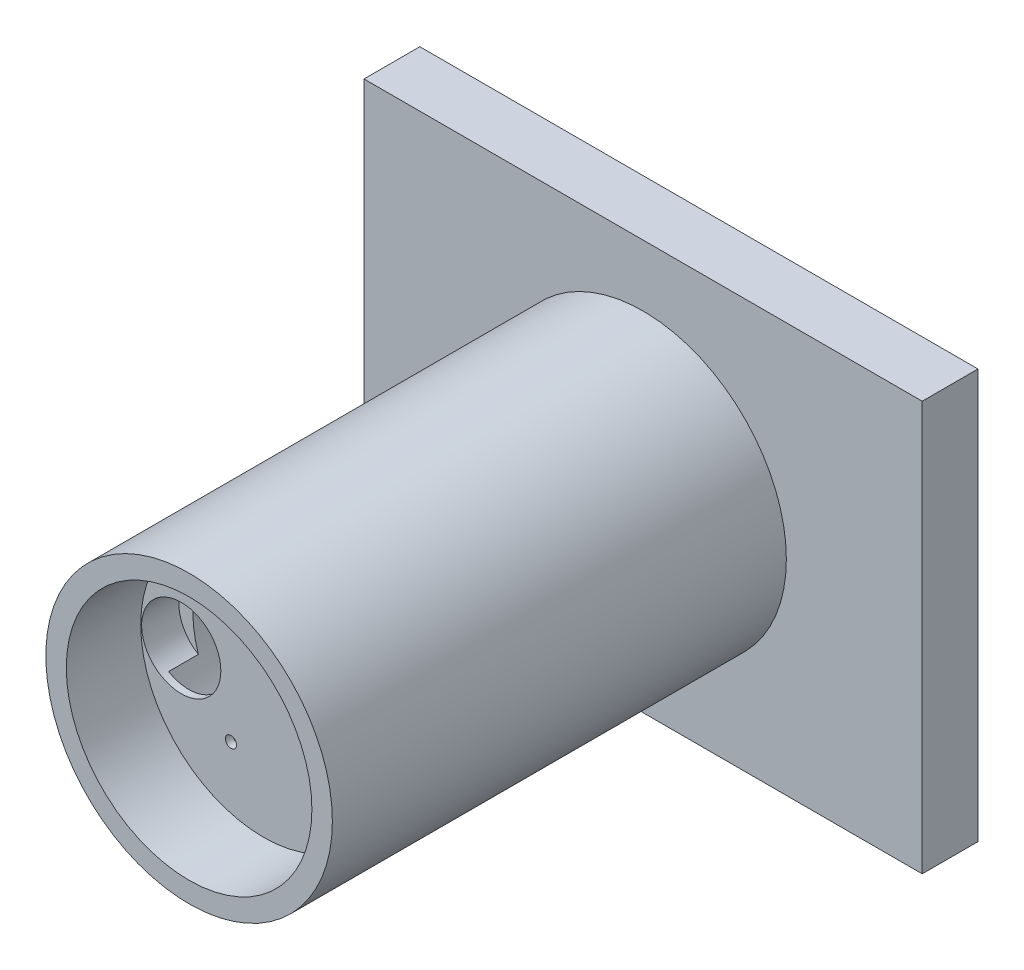
ISO-10303-21;
HEADER;
FILE_DESCRIPTION(('STEP AP214'),'2;1');
FILE_NAME('part.step','',(''),(''),'','','');
FILE_SCHEMA(('AUTOMOTIVE_DESIGN { 1 0 10303 214 1 1 1 1 }'));
ENDSEC;
DATA;
#1=APPLICATION_CONTEXT('core data for automotive mechanical design processes');
#2=APPLICATION_PROTOCOL_DEFINITION('international standard','automotive_design',2000,#1);
#3=PRODUCT_CONTEXT('',#1,'mechanical');
#4=PRODUCT('Part','Part','',(#3));
#5=PRODUCT_RELATED_PRODUCT_CATEGORY('part','',(#4));
#6=PRODUCT_DEFINITION_FORMATION('','',#4);
#7=PRODUCT_DEFINITION_CONTEXT('part definition',#1,'design');
#8=PRODUCT_DEFINITION('design','',#6,#7);
#9=PRODUCT_DEFINITION_SHAPE('','',#8);
#10=(LENGTH_UNIT() NAMED_UNIT(*) SI_UNIT(.MILLI.,.METRE.));
#11=(NAMED_UNIT(*) PLANE_ANGLE_UNIT() SI_UNIT($,.RADIAN.));
#12=(NAMED_UNIT(*) SI_UNIT($,.STERADIAN.) SOLID_ANGLE_UNIT());
#13=UNCERTAINTY_MEASURE_WITH_UNIT(LENGTH_MEASURE(1.E-05),#10,'distance_accuracy_value','');
#14=(GEOMETRIC_REPRESENTATION_CONTEXT(3) GLOBAL_UNCERTAINTY_ASSIGNED_CONTEXT((#13)) GLOBAL_UNIT_ASSIGNED_CONTEXT((#10,
#11,#12)) REPRESENTATION_CONTEXT('',''));
#15=CARTESIAN_POINT('',(0.,0.,0.));
#16=DIRECTION('',(0.,0.,1.));
#17=DIRECTION('',(1.,0.,0.));
#18=AXIS2_PLACEMENT_3D('',#15,#16,#17);
#19=CARTESIAN_POINT('',(75.,-55.,15.));
#20=DIRECTION('',(-1.,0.,0.));
#21=DIRECTION('',(0.,0.,1.));
#22=AXIS2_PLACEMENT_3D('',#19,#20,#21);
#23=PLANE('',#22);
#24=DIRECTION('',(0.,1.,0.));
#25=VECTOR('',#24,1.);
#26=CARTESIAN_POINT('',(75.,-55.,0.));
#27=LINE('',#26,#25);
#28=CARTESIAN_POINT('',(75.,-55.,0.));
#29=VERTEX_POINT('',#28);
#30=CARTESIAN_POINT('',(75.,55.,0.));
#31=VERTEX_POINT('',#30);
#32=EDGE_CURVE('E152',#29,#31,#27,.T.);
#33=ORIENTED_EDGE('',*,*,#32,.T.);
#34=DIRECTION('',(0.,0.,-1.));
#35=VECTOR('',#34,1.);
#36=CARTESIAN_POINT('',(75.,55.,15.));
#37=LINE('',#36,#35);
#38=CARTESIAN_POINT('',(75.,55.,15.));
#39=VERTEX_POINT('',#38);
#40=EDGE_CURVE('E155',#39,#31,#37,.T.);
#41=ORIENTED_EDGE('',*,*,#40,.F.);
#42=DIRECTION('',(0.,1.,0.));
#43=VECTOR('',#42,1.);
#44=CARTESIAN_POINT('',(75.,-55.,15.));
#45=LINE('',#44,#43);
#46=CARTESIAN_POINT('',(75.,-55.,15.));
#47=VERTEX_POINT('',#46);
#48=EDGE_CURVE('E156',#47,#39,#45,.T.);
#49=ORIENTED_EDGE('',*,*,#48,.F.);
#50=DIRECTION('',(0.,0.,-1.));
#51=VECTOR('',#50,1.);
#52=CARTESIAN_POINT('',(75.,-55.,15.));
#53=LINE('',#52,#51);
#54=EDGE_CURVE('E162',#47,#29,#53,.T.);
#55=ORIENTED_EDGE('',*,*,#54,.T.);
#56=EDGE_LOOP('',(#33,#41,#49,#55));
#57=FACE_BOUND('',#56,.T.);
#58=ADVANCED_FACE('F41',(#57),#23,.F.);
#59=CARTESIAN_POINT('',(-75.,55.,15.));
#60=DIRECTION('',(0.,-1.,0.));
#61=DIRECTION('',(0.,0.,-1.));
#62=AXIS2_PLACEMENT_3D('',#59,#60,#61);
#63=PLANE('',#62);
#64=DIRECTION('',(-1.,0.,0.));
#65=VECTOR('',#64,1.);
#66=CARTESIAN_POINT('',(-75.,55.,0.));
#67=LINE('',#66,#65);
#68=CARTESIAN_POINT('',(-75.,55.,0.));
#69=VERTEX_POINT('',#68);
#70=EDGE_CURVE('E165',#31,#69,#67,.T.);
#71=ORIENTED_EDGE('',*,*,#70,.T.);
#72=DIRECTION('',(0.,0.,-1.));
#73=VECTOR('',#72,1.);
#74=CARTESIAN_POINT('',(-75.,55.,15.));
#75=LINE('',#74,#73);
#76=CARTESIAN_POINT('',(-75.,55.,15.));
#77=VERTEX_POINT('',#76);
#78=EDGE_CURVE('E173',#77,#69,#75,.T.);
#79=ORIENTED_EDGE('',*,*,#78,.F.);
#80=DIRECTION('',(-1.,0.,0.));
#81=VECTOR('',#80,1.);
#82=CARTESIAN_POINT('',(-75.,55.,15.));
#83=LINE('',#82,#81);
#84=EDGE_CURVE('E93',#39,#77,#83,.T.);
#85=ORIENTED_EDGE('',*,*,#84,.F.);
#86=ORIENTED_EDGE('',*,*,#40,.T.);
#87=EDGE_LOOP('',(#71,#79,#85,#86));
#88=FACE_BOUND('',#87,.T.);
#89=ADVANCED_FACE('F176',(#88),#63,.F.);
#90=CARTESIAN_POINT('',(-75.,-55.,15.));
#91=DIRECTION('',(1.,0.,0.));
#92=DIRECTION('',(0.,0.,-1.));
#93=AXIS2_PLACEMENT_3D('',#90,#91,#92);
#94=PLANE('',#93);
#95=DIRECTION('',(0.,-1.,0.));
#96=VECTOR('',#95,1.);
#97=CARTESIAN_POINT('',(-75.,-55.,0.));
#98=LINE('',#97,#96);
#99=CARTESIAN_POINT('',(-75.,-55.,0.));
#100=VERTEX_POINT('',#99);
#101=EDGE_CURVE('E167',#69,#100,#98,.T.);
#102=ORIENTED_EDGE('',*,*,#101,.T.);
#103=DIRECTION('',(0.,0.,-1.));
#104=VECTOR('',#103,1.);
#105=CARTESIAN_POINT('',(-75.,-55.,15.));
#106=LINE('',#105,#104);
#107=CARTESIAN_POINT('',(-75.,-55.,15.));
#108=VERTEX_POINT('',#107);
#109=EDGE_CURVE('E171',#108,#100,#106,.T.);
#110=ORIENTED_EDGE('',*,*,#109,.F.);
#111=DIRECTION('',(0.,-1.,0.));
#112=VECTOR('',#111,1.);
#113=CARTESIAN_POINT('',(-75.,-55.,15.));
#114=LINE('',#113,#112);
#115=EDGE_CURVE('E159',#77,#108,#114,.T.);
#116=ORIENTED_EDGE('',*,*,#115,.F.);
#117=ORIENTED_EDGE('',*,*,#78,.T.);
#118=EDGE_LOOP('',(#102,#110,#116,#117));
#119=FACE_BOUND('',#118,.T.);
#120=ADVANCED_FACE('F185',(#119),#94,.F.);
#121=CARTESIAN_POINT('',(-75.,-55.,15.));
#122=DIRECTION('',(0.,1.,0.));
#123=DIRECTION('',(0.,0.,1.));
#124=AXIS2_PLACEMENT_3D('',#121,#122,#123);
#125=PLANE('',#124);
#126=DIRECTION('',(1.,0.,0.));
#127=VECTOR('',#126,1.);
#128=CARTESIAN_POINT('',(-75.,-55.,0.));
#129=LINE('',#128,#127);
#130=EDGE_CURVE('E85',#100,#29,#129,.T.);
#131=ORIENTED_EDGE('',*,*,#130,.T.);
#132=ORIENTED_EDGE('',*,*,#54,.F.);
#133=DIRECTION('',(1.,0.,0.));
#134=VECTOR('',#133,1.);
#135=CARTESIAN_POINT('',(-75.,-55.,15.));
#136=LINE('',#135,#134);
#137=EDGE_CURVE('E64',#108,#47,#136,.T.);
#138=ORIENTED_EDGE('',*,*,#137,.F.);
#139=ORIENTED_EDGE('',*,*,#109,.T.);
#140=EDGE_LOOP('',(#131,#132,#138,#139));
#141=FACE_BOUND('',#140,.T.);
#142=ADVANCED_FACE('F187',(#141),#125,.F.);
#143=CARTESIAN_POINT('',(0.,0.,15.));
#144=DIRECTION('',(0.,0.,-1.));
#145=DIRECTION('',(-1.,0.,0.));
#146=AXIS2_PLACEMENT_3D('',#143,#144,#145);
#147=PLANE('',#146);
#148=CARTESIAN_POINT('',(0.,0.,15.));
#149=DIRECTION('',(0.,0.,1.));
#150=DIRECTION('',(1.,0.,0.));
#151=AXIS2_PLACEMENT_3D('',#148,#149,#150);
#152=CIRCLE('',#151,38.5);
#153=CARTESIAN_POINT('',(38.5,0.,15.));
#154=VERTEX_POINT('',#153);
#155=EDGE_CURVE('E48',#154,#154,#152,.T.);
#156=ORIENTED_EDGE('',*,*,#155,.F.);
#157=EDGE_LOOP('',(#156));
#158=FACE_BOUND('',#157,.T.);
#159=ORIENTED_EDGE('',*,*,#48,.T.);
#160=ORIENTED_EDGE('',*,*,#84,.T.);
#161=ORIENTED_EDGE('',*,*,#115,.T.);
#162=ORIENTED_EDGE('',*,*,#137,.T.);
#163=EDGE_LOOP('',(#159,#160,#161,#162));
#164=FACE_BOUND('',#163,.T.);
#165=ADVANCED_FACE('F188',(#158,#164),#147,.F.);
#166=CARTESIAN_POINT('',(0.,0.,0.));
#167=DIRECTION('',(0.,0.,-1.));
#168=DIRECTION('',(-1.,0.,0.));
#169=AXIS2_PLACEMENT_3D('',#166,#167,#168);
#170=PLANE('',#169);
#171=CARTESIAN_POINT('',(0.,0.,0.));
#172=DIRECTION('',(0.,0.,-1.));
#173=DIRECTION('',(-1.,0.,0.));
#174=AXIS2_PLACEMENT_3D('',#171,#172,#173);
#175=CIRCLE('',#174,29.);
#176=CARTESIAN_POINT('',(-29.,0.,0.));
#177=VERTEX_POINT('',#176);
#178=EDGE_CURVE('E149',#177,#177,#175,.T.);
#179=ORIENTED_EDGE('',*,*,#178,.F.);
#180=EDGE_LOOP('',(#179));
#181=FACE_BOUND('',#180,.T.);
#182=ORIENTED_EDGE('',*,*,#32,.F.);
#183=ORIENTED_EDGE('',*,*,#130,.F.);
#184=ORIENTED_EDGE('',*,*,#101,.F.);
#185=ORIENTED_EDGE('',*,*,#70,.F.);
#186=EDGE_LOOP('',(#182,#183,#184,#185));
#187=FACE_BOUND('',#186,.T.);
#188=ADVANCED_FACE('F181',(#181,#187),#170,.T.);
#189=CARTESIAN_POINT('',(0.,0.,115.));
#190=DIRECTION('',(0.,0.,-1.));
#191=DIRECTION('',(-1.,0.,0.));
#192=AXIS2_PLACEMENT_3D('',#189,#190,#191);
#193=CYLINDRICAL_SURFACE('',#192,38.5);
#194=ORIENTED_EDGE('',*,*,#155,.T.);
#195=EDGE_LOOP('',(#194));
#196=FACE_BOUND('',#195,.T.);
#197=CARTESIAN_POINT('',(0.,0.,137.));
#198=DIRECTION('',(0.,0.,1.));
#199=DIRECTION('',(1.,0.,0.));
#200=AXIS2_PLACEMENT_3D('',#197,#198,#199);
#201=CIRCLE('',#200,38.5);
#202=CARTESIAN_POINT('',(38.5,0.,137.));
#203=VERTEX_POINT('',#202);
#204=EDGE_CURVE('E124',#203,#203,#201,.T.);
#205=ORIENTED_EDGE('',*,*,#204,.F.);
#206=EDGE_LOOP('',(#205));
#207=FACE_BOUND('',#206,.T.);
#208=ADVANCED_FACE('F196',(#196,#207),#193,.T.);
#209=CARTESIAN_POINT('',(0.,0.,-30.));
#210=DIRECTION('',(0.,0.,1.));
#211=DIRECTION('',(1.,0.,0.));
#212=AXIS2_PLACEMENT_3D('',#209,#210,#211);
#213=CYLINDRICAL_SURFACE('',#212,29.);
#214=ORIENTED_EDGE('',*,*,#178,.T.);
#215=EDGE_LOOP('',(#214));
#216=FACE_BOUND('',#215,.T.);
#217=CARTESIAN_POINT('',(0.,0.,107.));
#218=DIRECTION('',(0.,0.,1.));
#219=DIRECTION('',(1.,0.,0.));
#220=AXIS2_PLACEMENT_3D('',#217,#218,#219);
#221=CIRCLE('',#220,29.);
#222=CARTESIAN_POINT('',(-27.5117243117778,-9.17087920500165,107.));
#223=VERTEX_POINT('',#222);
#224=CARTESIAN_POINT('',(-27.5117243117778,9.17087920500165,107.));
#225=VERTEX_POINT('',#224);
#226=EDGE_CURVE('E11',#223,#225,#221,.F.);
#227=ORIENTED_EDGE('',*,*,#226,.F.);
#228=DIRECTION('',(0.,0.,1.));
#229=VECTOR('',#228,1.);
#230=CARTESIAN_POINT('',(-27.5117243117778,-9.17087920500165,112.));
#231=LINE('',#230,#229);
#232=CARTESIAN_POINT('',(-27.5117243117778,-9.17087920500165,115.));
#233=VERTEX_POINT('',#232);
#234=EDGE_CURVE('E108',#223,#233,#231,.T.);
#235=ORIENTED_EDGE('',*,*,#234,.T.);
#236=CARTESIAN_POINT('',(0.,0.,115.));
#237=DIRECTION('',(0.,0.,1.));
#238=DIRECTION('',(1.,0.,0.));
#239=AXIS2_PLACEMENT_3D('',#236,#237,#238);
#240=CIRCLE('',#239,29.);
#241=CARTESIAN_POINT('',(-27.5117243117778,9.17087920500165,115.));
#242=VERTEX_POINT('',#241);
#243=EDGE_CURVE('E115',#242,#233,#240,.F.);
#244=ORIENTED_EDGE('',*,*,#243,.F.);
#245=DIRECTION('',(0.,0.,1.));
#246=VECTOR('',#245,1.);
#247=CARTESIAN_POINT('',(-27.5117243117778,9.17087920500165,112.));
#248=LINE('',#247,#246);
#249=EDGE_CURVE('E55',#242,#225,#248,.F.);
#250=ORIENTED_EDGE('',*,*,#249,.T.);
#251=EDGE_LOOP('',(#227,#235,#244,#250));
#252=FACE_BOUND('',#251,.T.);
#253=ADVANCED_FACE('F113',(#216,#252),#213,.F.);
#254=CARTESIAN_POINT('',(0.,0.,115.));
#255=DIRECTION('',(0.,0.,1.));
#256=DIRECTION('',(1.,0.,0.));
#257=AXIS2_PLACEMENT_3D('',#254,#255,#256);
#258=PLANE('',#257);
#259=CARTESIAN_POINT('',(17.5,0.,115.));
#260=DIRECTION('',(0.,0.,1.));
#261=DIRECTION('',(1.,0.,0.));
#262=AXIS2_PLACEMENT_3D('',#259,#260,#261);
#263=CIRCLE('',#262,1.5);
#264=CARTESIAN_POINT('',(19.,0.,115.));
#265=VERTEX_POINT('',#264);
#266=EDGE_CURVE('E131',#265,#265,#263,.T.);
#267=ORIENTED_EDGE('',*,*,#266,.T.);
#268=EDGE_LOOP('',(#267));
#269=FACE_BOUND('',#268,.T.);
#270=CARTESIAN_POINT('',(-8.75000000000007,-15.1554445662276,115.));
#271=DIRECTION('',(0.,0.,1.));
#272=DIRECTION('',(1.,0.,0.));
#273=AXIS2_PLACEMENT_3D('',#270,#271,#272);
#274=CIRCLE('',#273,1.5);
#275=CARTESIAN_POINT('',(-7.25000000000007,-15.1554445662276,115.));
#276=VERTEX_POINT('',#275);
#277=EDGE_CURVE('E140',#276,#276,#274,.T.);
#278=ORIENTED_EDGE('',*,*,#277,.T.);
#279=EDGE_LOOP('',(#278));
#280=FACE_BOUND('',#279,.T.);
#281=CARTESIAN_POINT('',(-8.74999999999986,15.1554445662278,115.));
#282=DIRECTION('',(0.,0.,1.));
#283=DIRECTION('',(1.,0.,0.));
#284=AXIS2_PLACEMENT_3D('',#281,#282,#283);
#285=CIRCLE('',#284,1.5);
#286=CARTESIAN_POINT('',(-7.24999999999986,15.1554445662278,115.));
#287=VERTEX_POINT('',#286);
#288=EDGE_CURVE('E130',#287,#287,#285,.T.);
#289=ORIENTED_EDGE('',*,*,#288,.T.);
#290=EDGE_LOOP('',(#289));
#291=FACE_BOUND('',#290,.T.);
#292=ORIENTED_EDGE('',*,*,#243,.T.);
#293=CARTESIAN_POINT('',(-22.1108518501265,0.,115.));
#294=DIRECTION('',(0.,0.,1.));
#295=DIRECTION('',(1.,0.,0.));
#296=AXIS2_PLACEMENT_3D('',#293,#294,#295);
#297=CIRCLE('',#296,10.6430469669054);
#298=EDGE_CURVE('E109',#233,#242,#297,.T.);
#299=ORIENTED_EDGE('',*,*,#298,.T.);
#300=EDGE_LOOP('',(#292,#299));
#301=FACE_BOUND('',#300,.T.);
#302=ADVANCED_FACE('F308',(#269,#280,#291,#301),#258,.F.);
#303=CARTESIAN_POINT('',(0.,0.,117.));
#304=DIRECTION('',(0.,0.,1.));
#305=DIRECTION('',(1.,0.,0.));
#306=AXIS2_PLACEMENT_3D('',#303,#304,#305);
#307=PLANE('',#306);
#308=CARTESIAN_POINT('',(-22.1108518501265,0.,117.));
#309=DIRECTION('',(0.,0.,1.));
#310=DIRECTION('',(1.,0.,0.));
#311=AXIS2_PLACEMENT_3D('',#308,#309,#310);
#312=CIRCLE('',#311,10.6430469669054);
#313=CARTESIAN_POINT('',(-11.4678048832211,0.,117.));
#314=VERTEX_POINT('',#313);
#315=EDGE_CURVE('E110',#314,#314,#312,.T.);
#316=ORIENTED_EDGE('',*,*,#315,.F.);
#317=EDGE_LOOP('',(#316));
#318=FACE_BOUND('',#317,.T.);
#319=CARTESIAN_POINT('',(17.5,0.,117.));
#320=DIRECTION('',(0.,0.,1.));
#321=DIRECTION('',(1.,0.,0.));
#322=AXIS2_PLACEMENT_3D('',#319,#320,#321);
#323=CIRCLE('',#322,1.5);
#324=CARTESIAN_POINT('',(19.,0.,117.));
#325=VERTEX_POINT('',#324);
#326=EDGE_CURVE('E134',#325,#325,#323,.T.);
#327=ORIENTED_EDGE('',*,*,#326,.F.);
#328=EDGE_LOOP('',(#327));
#329=FACE_BOUND('',#328,.T.);
#330=CARTESIAN_POINT('',(-8.75000000000007,-15.1554445662276,117.));
#331=DIRECTION('',(0.,0.,1.));
#332=DIRECTION('',(1.,0.,0.));
#333=AXIS2_PLACEMENT_3D('',#330,#331,#332);
#334=CIRCLE('',#333,1.5);
#335=CARTESIAN_POINT('',(-7.25000000000007,-15.1554445662276,117.));
#336=VERTEX_POINT('',#335);
#337=EDGE_CURVE('E137',#336,#336,#334,.T.);
#338=ORIENTED_EDGE('',*,*,#337,.F.);
#339=EDGE_LOOP('',(#338));
#340=FACE_BOUND('',#339,.T.);
#341=CARTESIAN_POINT('',(-8.74999999999986,15.1554445662278,117.));
#342=DIRECTION('',(0.,0.,1.));
#343=DIRECTION('',(1.,0.,0.));
#344=AXIS2_PLACEMENT_3D('',#341,#342,#343);
#345=CIRCLE('',#344,1.5);
#346=CARTESIAN_POINT('',(-7.24999999999986,15.1554445662278,117.));
#347=VERTEX_POINT('',#346);
#348=EDGE_CURVE('E143',#347,#347,#345,.T.);
#349=ORIENTED_EDGE('',*,*,#348,.F.);
#350=EDGE_LOOP('',(#349));
#351=FACE_BOUND('',#350,.T.);
#352=CARTESIAN_POINT('',(0.,0.,117.));
#353=DIRECTION('',(0.,0.,1.));
#354=DIRECTION('',(1.,0.,0.));
#355=AXIS2_PLACEMENT_3D('',#352,#353,#354);
#356=CIRCLE('',#355,33.);
#357=CARTESIAN_POINT('',(33.,0.,117.));
#358=VERTEX_POINT('',#357);
#359=EDGE_CURVE('E127',#358,#358,#356,.F.);
#360=ORIENTED_EDGE('',*,*,#359,.F.);
#361=EDGE_LOOP('',(#360));
#362=FACE_BOUND('',#361,.T.);
#363=ADVANCED_FACE('F242',(#318,#329,#340,#351,#362),#307,.T.);
#364=CARTESIAN_POINT('',(-8.74999999999986,15.1554445662278,115.));
#365=DIRECTION('',(0.,0.,1.));
#366=DIRECTION('',(1.,0.,0.));
#367=AXIS2_PLACEMENT_3D('',#364,#365,#366);
#368=CYLINDRICAL_SURFACE('',#367,1.5);
#369=ORIENTED_EDGE('',*,*,#288,.F.);
#370=EDGE_LOOP('',(#369));
#371=FACE_BOUND('',#370,.T.);
#372=ORIENTED_EDGE('',*,*,#348,.T.);
#373=EDGE_LOOP('',(#372));
#374=FACE_BOUND('',#373,.T.);
#375=ADVANCED_FACE('F236',(#371,#374),#368,.F.);
#376=CARTESIAN_POINT('',(-8.75000000000007,-15.1554445662276,115.));
#377=DIRECTION('',(0.,0.,1.));
#378=DIRECTION('',(1.,0.,0.));
#379=AXIS2_PLACEMENT_3D('',#376,#377,#378);
#380=CYLINDRICAL_SURFACE('',#379,1.5);
#381=ORIENTED_EDGE('',*,*,#277,.F.);
#382=EDGE_LOOP('',(#381));
#383=FACE_BOUND('',#382,.T.);
#384=ORIENTED_EDGE('',*,*,#337,.T.);
#385=EDGE_LOOP('',(#384));
#386=FACE_BOUND('',#385,.T.);
#387=ADVANCED_FACE('F241',(#383,#386),#380,.F.);
#388=CARTESIAN_POINT('',(17.5,0.,115.));
#389=DIRECTION('',(0.,0.,1.));
#390=DIRECTION('',(1.,0.,0.));
#391=AXIS2_PLACEMENT_3D('',#388,#389,#390);
#392=CYLINDRICAL_SURFACE('',#391,1.5);
#393=ORIENTED_EDGE('',*,*,#266,.F.);
#394=EDGE_LOOP('',(#393));
#395=FACE_BOUND('',#394,.T.);
#396=ORIENTED_EDGE('',*,*,#326,.T.);
#397=EDGE_LOOP('',(#396));
#398=FACE_BOUND('',#397,.T.);
#399=ADVANCED_FACE('F255',(#395,#398),#392,.F.);
#400=CARTESIAN_POINT('',(0.,0.,137.));
#401=DIRECTION('',(0.,0.,1.));
#402=DIRECTION('',(1.,0.,0.));
#403=AXIS2_PLACEMENT_3D('',#400,#401,#402);
#404=PLANE('',#403);
#405=ORIENTED_EDGE('',*,*,#204,.T.);
#406=EDGE_LOOP('',(#405));
#407=FACE_BOUND('',#406,.T.);
#408=CARTESIAN_POINT('',(0.,0.,137.));
#409=DIRECTION('',(0.,0.,1.));
#410=DIRECTION('',(1.,0.,0.));
#411=AXIS2_PLACEMENT_3D('',#408,#409,#410);
#412=CIRCLE('',#411,33.);
#413=CARTESIAN_POINT('',(33.,0.,137.));
#414=VERTEX_POINT('',#413);
#415=EDGE_CURVE('E117',#414,#414,#412,.T.);
#416=ORIENTED_EDGE('',*,*,#415,.F.);
#417=EDGE_LOOP('',(#416));
#418=FACE_BOUND('',#417,.T.);
#419=ADVANCED_FACE('F266',(#407,#418),#404,.T.);
#420=CARTESIAN_POINT('',(0.,0.,137.));
#421=DIRECTION('',(0.,0.,-1.));
#422=DIRECTION('',(-1.,0.,0.));
#423=AXIS2_PLACEMENT_3D('',#420,#421,#422);
#424=CYLINDRICAL_SURFACE('',#423,33.);
#425=ORIENTED_EDGE('',*,*,#359,.T.);
#426=EDGE_LOOP('',(#425));
#427=FACE_BOUND('',#426,.T.);
#428=ORIENTED_EDGE('',*,*,#415,.T.);
#429=EDGE_LOOP('',(#428));
#430=FACE_BOUND('',#429,.T.);
#431=ADVANCED_FACE('F285',(#427,#430),#424,.F.);
#432=CARTESIAN_POINT('',(-22.1108518501265,0.,107.));
#433=DIRECTION('',(0.,0.,1.));
#434=DIRECTION('',(1.,0.,0.));
#435=AXIS2_PLACEMENT_3D('',#432,#433,#434);
#436=PLANE('',#435);
#437=ORIENTED_EDGE('',*,*,#226,.T.);
#438=CARTESIAN_POINT('',(-22.1108518501265,0.,107.));
#439=DIRECTION('',(0.,0.,1.));
#440=DIRECTION('',(1.,0.,0.));
#441=AXIS2_PLACEMENT_3D('',#438,#439,#440);
#442=CIRCLE('',#441,10.6430469669054);
#443=EDGE_CURVE('E104',#225,#223,#442,.T.);
#444=ORIENTED_EDGE('',*,*,#443,.T.);
#445=EDGE_LOOP('',(#437,#444));
#446=FACE_BOUND('',#445,.T.);
#447=ADVANCED_FACE('F103',(#446),#436,.T.);
#448=CARTESIAN_POINT('',(-22.1108518501265,0.,107.));
#449=DIRECTION('',(0.,0.,1.));
#450=DIRECTION('',(1.,0.,0.));
#451=AXIS2_PLACEMENT_3D('',#448,#449,#450);
#452=CYLINDRICAL_SURFACE('',#451,10.6430469669054);
#453=ORIENTED_EDGE('',*,*,#315,.T.);
#454=EDGE_LOOP('',(#453));
#455=FACE_BOUND('',#454,.T.);
#456=ORIENTED_EDGE('',*,*,#443,.F.);
#457=ORIENTED_EDGE('',*,*,#249,.F.);
#458=ORIENTED_EDGE('',*,*,#298,.F.);
#459=ORIENTED_EDGE('',*,*,#234,.F.);
#460=EDGE_LOOP('',(#456,#457,#458,#459));
#461=FACE_BOUND('',#460,.T.);
#462=ADVANCED_FACE('F107',(#455,#461),#452,.F.);
#463=CLOSED_SHELL('',(#58,#89,#120,#142,#165,#188,#208,#253,#302,#363,#375,#387,#399,#419,#431,
#447,#462));
#464=MANIFOLD_SOLID_BREP('B2',#463);
#465=ADVANCED_BREP_SHAPE_REPRESENTATION('',(#18,#464),#14);
#466=SHAPE_DEFINITION_REPRESENTATION(#9,#465);
ENDSEC;
END-ISO-10303-21;
